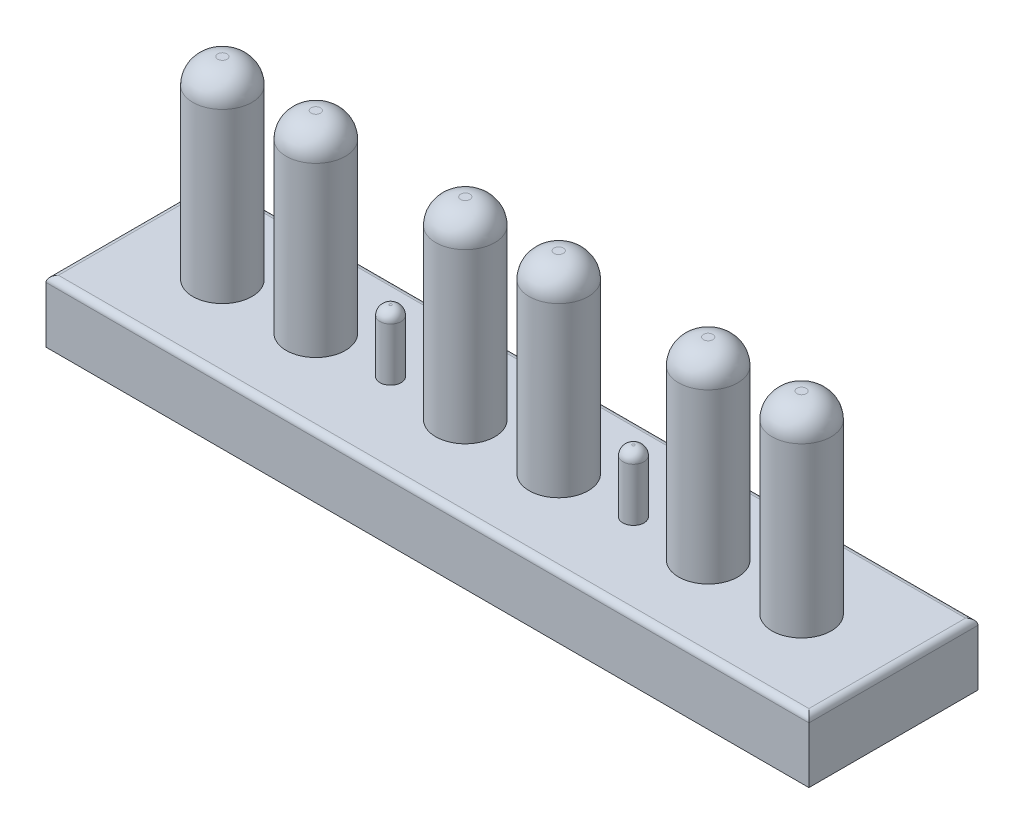
ISO-10303-21;
HEADER;
FILE_DESCRIPTION(('STEP AP214'),'2;1');
FILE_NAME('part.step','',(''),(''),'','','');
FILE_SCHEMA(('AUTOMOTIVE_DESIGN { 1 0 10303 214 1 1 1 1 }'));
ENDSEC;
DATA;
#1=APPLICATION_CONTEXT('core data for automotive mechanical design processes');
#2=APPLICATION_PROTOCOL_DEFINITION('international standard','automotive_design',2000,#1);
#3=PRODUCT_CONTEXT('',#1,'mechanical');
#4=PRODUCT('Part','Part','',(#3));
#5=PRODUCT_RELATED_PRODUCT_CATEGORY('part','',(#4));
#6=PRODUCT_DEFINITION_FORMATION('','',#4);
#7=PRODUCT_DEFINITION_CONTEXT('part definition',#1,'design');
#8=PRODUCT_DEFINITION('design','',#6,#7);
#9=PRODUCT_DEFINITION_SHAPE('','',#8);
#10=(LENGTH_UNIT() NAMED_UNIT(*) SI_UNIT(.MILLI.,.METRE.));
#11=(NAMED_UNIT(*) PLANE_ANGLE_UNIT() SI_UNIT($,.RADIAN.));
#12=(NAMED_UNIT(*) SI_UNIT($,.STERADIAN.) SOLID_ANGLE_UNIT());
#13=UNCERTAINTY_MEASURE_WITH_UNIT(LENGTH_MEASURE(1.E-05),#10,'distance_accuracy_value','');
#14=(GEOMETRIC_REPRESENTATION_CONTEXT(3) GLOBAL_UNCERTAINTY_ASSIGNED_CONTEXT((#13)) GLOBAL_UNIT_ASSIGNED_CONTEXT((#10,
#11,#12)) REPRESENTATION_CONTEXT('',''));
#15=CARTESIAN_POINT('',(0.,0.,0.));
#16=DIRECTION('',(0.,0.,1.));
#17=DIRECTION('',(1.,0.,0.));
#18=AXIS2_PLACEMENT_3D('',#15,#16,#17);
#19=CARTESIAN_POINT('',(62.4574978838138,62.,0.));
#20=DIRECTION('',(0.,-1.,0.));
#21=DIRECTION('',(0.,0.,-1.));
#22=AXIS2_PLACEMENT_3D('',#19,#20,#21);
#23=CYLINDRICAL_SURFACE('',#22,9.49999999999999);
#24=CARTESIAN_POINT('',(62.4574978838138,54.,0.));
#25=DIRECTION('',(0.,1.,0.));
#26=DIRECTION('',(0.,0.,1.));
#27=AXIS2_PLACEMENT_3D('',#24,#25,#26);
#28=CIRCLE('',#27,9.49999999999999);
#29=CARTESIAN_POINT('',(62.4574978838138,54.,9.5));
#30=VERTEX_POINT('',#29);
#31=EDGE_CURVE('E122',#30,#30,#28,.F.);
#32=ORIENTED_EDGE('',*,*,#31,.T.);
#33=EDGE_LOOP('',(#32));
#34=FACE_BOUND('',#33,.T.);
#35=CARTESIAN_POINT('',(62.4574978838138,0.,0.));
#36=DIRECTION('',(0.,1.,0.));
#37=DIRECTION('',(0.,0.,1.));
#38=AXIS2_PLACEMENT_3D('',#35,#36,#37);
#39=CIRCLE('',#38,9.49999999999999);
#40=CARTESIAN_POINT('',(62.4574978838138,0.,9.5));
#41=VERTEX_POINT('',#40);
#42=EDGE_CURVE('E111',#41,#41,#39,.T.);
#43=ORIENTED_EDGE('',*,*,#42,.T.);
#44=EDGE_LOOP('',(#43));
#45=FACE_BOUND('',#44,.T.);
#46=ADVANCED_FACE('F35',(#34,#45),#23,.T.);
#47=CARTESIAN_POINT('',(62.4574978838138,62.,0.));
#48=DIRECTION('',(0.,1.,0.));
#49=DIRECTION('',(0.,0.,1.));
#50=AXIS2_PLACEMENT_3D('',#47,#48,#49);
#51=PLANE('',#50);
#52=CARTESIAN_POINT('',(62.4574978838138,62.,0.));
#53=DIRECTION('',(0.,1.,0.));
#54=DIRECTION('',(0.,0.,1.));
#55=AXIS2_PLACEMENT_3D('',#52,#53,#54);
#56=CIRCLE('',#55,1.49999999999999);
#57=CARTESIAN_POINT('',(62.4574978838138,62.,1.5));
#58=VERTEX_POINT('',#57);
#59=EDGE_CURVE('E114',#58,#58,#56,.T.);
#60=ORIENTED_EDGE('',*,*,#59,.T.);
#61=EDGE_LOOP('',(#60));
#62=FACE_BOUND('',#61,.T.);
#63=ADVANCED_FACE('F238',(#62),#51,.T.);
#64=CARTESIAN_POINT('',(62.4574978838138,54.,0.));
#65=DIRECTION('',(0.,1.,0.));
#66=DIRECTION('',(0.,0.,1.));
#67=AXIS2_PLACEMENT_3D('',#64,#65,#66);
#68=DEGENERATE_TOROIDAL_SURFACE('',#67,1.49999999999999,8.,.T.);
#69=ORIENTED_EDGE('',*,*,#31,.F.);
#70=EDGE_LOOP('',(#69));
#71=FACE_BOUND('',#70,.T.);
#72=ORIENTED_EDGE('',*,*,#59,.F.);
#73=EDGE_LOOP('',(#72));
#74=FACE_BOUND('',#73,.T.);
#75=ADVANCED_FACE('F244',(#71,#74),#68,.T.);
#76=CARTESIAN_POINT('',(-153.042502116186,-20.,-27.146560379265));
#77=DIRECTION('',(1.,0.,0.));
#78=DIRECTION('',(0.,0.,-1.));
#79=AXIS2_PLACEMENT_3D('',#76,#77,#78);
#80=PLANE('',#79);
#81=DIRECTION('',(0.,1.,0.));
#82=VECTOR('',#81,1.);
#83=CARTESIAN_POINT('',(-153.042502116186,-20.,27.1465603792649));
#84=LINE('',#83,#82);
#85=CARTESIAN_POINT('',(-153.042502116186,-20.,27.1465603792649));
#86=VERTEX_POINT('',#85);
#87=CARTESIAN_POINT('',(-153.042502116186,-2.,27.1465603792649));
#88=VERTEX_POINT('',#87);
#89=EDGE_CURVE('E218',#86,#88,#84,.T.);
#90=ORIENTED_EDGE('',*,*,#89,.T.);
#91=DIRECTION('',(0.,0.,-1.));
#92=VECTOR('',#91,1.);
#93=CARTESIAN_POINT('',(-153.042502116186,-2.,-27.146560379265));
#94=LINE('',#93,#92);
#95=CARTESIAN_POINT('',(-153.042502116186,-2.,-27.146560379265));
#96=VERTEX_POINT('',#95);
#97=EDGE_CURVE('E110',#88,#96,#94,.T.);
#98=ORIENTED_EDGE('',*,*,#97,.T.);
#99=DIRECTION('',(0.,1.,0.));
#100=VECTOR('',#99,1.);
#101=CARTESIAN_POINT('',(-153.042502116186,-20.,-27.146560379265));
#102=LINE('',#101,#100);
#103=CARTESIAN_POINT('',(-153.042502116186,-20.,-27.146560379265));
#104=VERTEX_POINT('',#103);
#105=EDGE_CURVE('E91',#104,#96,#102,.T.);
#106=ORIENTED_EDGE('',*,*,#105,.F.);
#107=DIRECTION('',(0.,0.,-1.));
#108=VECTOR('',#107,1.);
#109=CARTESIAN_POINT('',(-153.042502116186,-20.,-27.146560379265));
#110=LINE('',#109,#108);
#111=EDGE_CURVE('E96',#86,#104,#110,.T.);
#112=ORIENTED_EDGE('',*,*,#111,.F.);
#113=EDGE_LOOP('',(#90,#98,#106,#112));
#114=FACE_BOUND('',#113,.T.);
#115=ADVANCED_FACE('F108',(#114),#80,.F.);
#116=CARTESIAN_POINT('',(91.9574978838138,-20.,-27.1465603792649));
#117=DIRECTION('',(0.,0.,1.));
#118=DIRECTION('',(1.,0.,0.));
#119=AXIS2_PLACEMENT_3D('',#116,#117,#118);
#120=PLANE('',#119);
#121=ORIENTED_EDGE('',*,*,#105,.T.);
#122=DIRECTION('',(1.,0.,0.));
#123=VECTOR('',#122,1.);
#124=CARTESIAN_POINT('',(91.9574978838138,-2.,-27.1465603792649));
#125=LINE('',#124,#123);
#126=CARTESIAN_POINT('',(91.9574978838138,-2.,-27.1465603792649));
#127=VERTEX_POINT('',#126);
#128=EDGE_CURVE('E11',#96,#127,#125,.T.);
#129=ORIENTED_EDGE('',*,*,#128,.T.);
#130=DIRECTION('',(0.,1.,0.));
#131=VECTOR('',#130,1.);
#132=CARTESIAN_POINT('',(91.9574978838138,-20.,-27.1465603792649));
#133=LINE('',#132,#131);
#134=CARTESIAN_POINT('',(91.9574978838138,-20.,-27.1465603792649));
#135=VERTEX_POINT('',#134);
#136=EDGE_CURVE('E92',#135,#127,#133,.T.);
#137=ORIENTED_EDGE('',*,*,#136,.F.);
#138=DIRECTION('',(1.,0.,0.));
#139=VECTOR('',#138,1.);
#140=CARTESIAN_POINT('',(91.9574978838138,-20.,-27.1465603792649));
#141=LINE('',#140,#139);
#142=EDGE_CURVE('E87',#104,#135,#141,.T.);
#143=ORIENTED_EDGE('',*,*,#142,.F.);
#144=EDGE_LOOP('',(#121,#129,#137,#143));
#145=FACE_BOUND('',#144,.T.);
#146=ADVANCED_FACE('F89',(#145),#120,.F.);
#147=CARTESIAN_POINT('',(91.9574978838138,-20.,-27.1465603792649));
#148=DIRECTION('',(-1.,0.,0.));
#149=DIRECTION('',(0.,0.,1.));
#150=AXIS2_PLACEMENT_3D('',#147,#148,#149);
#151=PLANE('',#150);
#152=ORIENTED_EDGE('',*,*,#136,.T.);
#153=DIRECTION('',(0.,0.,1.));
#154=VECTOR('',#153,1.);
#155=CARTESIAN_POINT('',(91.9574978838138,-2.,-27.1465603792649));
#156=LINE('',#155,#154);
#157=CARTESIAN_POINT('',(91.9574978838138,-2.,27.1465603792649));
#158=VERTEX_POINT('',#157);
#159=EDGE_CURVE('E44',#127,#158,#156,.T.);
#160=ORIENTED_EDGE('',*,*,#159,.T.);
#161=DIRECTION('',(0.,1.,0.));
#162=VECTOR('',#161,1.);
#163=CARTESIAN_POINT('',(91.9574978838138,-20.,27.1465603792649));
#164=LINE('',#163,#162);
#165=CARTESIAN_POINT('',(91.9574978838138,-20.,27.1465603792649));
#166=VERTEX_POINT('',#165);
#167=EDGE_CURVE('E116',#166,#158,#164,.T.);
#168=ORIENTED_EDGE('',*,*,#167,.F.);
#169=DIRECTION('',(0.,0.,1.));
#170=VECTOR('',#169,1.);
#171=CARTESIAN_POINT('',(91.9574978838138,-20.,-27.1465603792649));
#172=LINE('',#171,#170);
#173=EDGE_CURVE('E95',#135,#166,#172,.T.);
#174=ORIENTED_EDGE('',*,*,#173,.F.);
#175=EDGE_LOOP('',(#152,#160,#168,#174));
#176=FACE_BOUND('',#175,.T.);
#177=ADVANCED_FACE('F261',(#176),#151,.F.);
#178=CARTESIAN_POINT('',(91.9574978838138,-20.,27.1465603792649));
#179=DIRECTION('',(0.,0.,-1.));
#180=DIRECTION('',(-1.,0.,0.));
#181=AXIS2_PLACEMENT_3D('',#178,#179,#180);
#182=PLANE('',#181);
#183=ORIENTED_EDGE('',*,*,#167,.T.);
#184=DIRECTION('',(-1.,0.,0.));
#185=VECTOR('',#184,1.);
#186=CARTESIAN_POINT('',(91.9574978838138,-2.,27.1465603792649));
#187=LINE('',#186,#185);
#188=EDGE_CURVE('E156',#158,#88,#187,.T.);
#189=ORIENTED_EDGE('',*,*,#188,.T.);
#190=ORIENTED_EDGE('',*,*,#89,.F.);
#191=DIRECTION('',(-1.,0.,0.));
#192=VECTOR('',#191,1.);
#193=CARTESIAN_POINT('',(91.9574978838138,-20.,27.1465603792649));
#194=LINE('',#193,#192);
#195=EDGE_CURVE('E101',#166,#86,#194,.T.);
#196=ORIENTED_EDGE('',*,*,#195,.F.);
#197=EDGE_LOOP('',(#183,#189,#190,#196));
#198=FACE_BOUND('',#197,.T.);
#199=ADVANCED_FACE('F220',(#198),#182,.F.);
#200=CARTESIAN_POINT('',(0.,-20.,0.));
#201=DIRECTION('',(0.,-1.,0.));
#202=DIRECTION('',(0.,0.,-1.));
#203=AXIS2_PLACEMENT_3D('',#200,#201,#202);
#204=PLANE('',#203);
#205=ORIENTED_EDGE('',*,*,#111,.T.);
#206=ORIENTED_EDGE('',*,*,#142,.T.);
#207=ORIENTED_EDGE('',*,*,#173,.T.);
#208=ORIENTED_EDGE('',*,*,#195,.T.);
#209=EDGE_LOOP('',(#205,#206,#207,#208));
#210=FACE_BOUND('',#209,.T.);
#211=ADVANCED_FACE('F99',(#210),#204,.T.);
#212=CARTESIAN_POINT('',(0.,0.,0.));
#213=DIRECTION('',(0.,-1.,0.));
#214=DIRECTION('',(0.,0.,-1.));
#215=AXIS2_PLACEMENT_3D('',#212,#213,#214);
#216=PLANE('',#215);
#217=DIRECTION('',(1.,0.,0.));
#218=VECTOR('',#217,1.);
#219=CARTESIAN_POINT('',(0.,0.,-25.146560379265));
#220=LINE('',#219,#218);
#221=CARTESIAN_POINT('',(89.9574978838138,0.,-25.1465603792649));
#222=VERTEX_POINT('',#221);
#223=CARTESIAN_POINT('',(-151.042502116186,0.,-25.146560379265));
#224=VERTEX_POINT('',#223);
#225=EDGE_CURVE('E147',#222,#224,#220,.F.);
#226=ORIENTED_EDGE('',*,*,#225,.T.);
#227=DIRECTION('',(0.,0.,-1.));
#228=VECTOR('',#227,1.);
#229=CARTESIAN_POINT('',(-151.042502116186,0.,0.));
#230=LINE('',#229,#228);
#231=CARTESIAN_POINT('',(-151.042502116186,0.,25.1465603792649));
#232=VERTEX_POINT('',#231);
#233=EDGE_CURVE('E153',#224,#232,#230,.F.);
#234=ORIENTED_EDGE('',*,*,#233,.T.);
#235=DIRECTION('',(-1.,0.,0.));
#236=VECTOR('',#235,1.);
#237=CARTESIAN_POINT('',(0.,0.,25.1465603792649));
#238=LINE('',#237,#236);
#239=CARTESIAN_POINT('',(89.9574978838138,0.,25.1465603792649));
#240=VERTEX_POINT('',#239);
#241=EDGE_CURVE('E151',#232,#240,#238,.F.);
#242=ORIENTED_EDGE('',*,*,#241,.T.);
#243=DIRECTION('',(0.,0.,1.));
#244=VECTOR('',#243,1.);
#245=CARTESIAN_POINT('',(89.9574978838138,0.,0.));
#246=LINE('',#245,#244);
#247=EDGE_CURVE('E149',#240,#222,#246,.F.);
#248=ORIENTED_EDGE('',*,*,#247,.T.);
#249=EDGE_LOOP('',(#226,#234,#242,#248));
#250=FACE_BOUND('',#249,.T.);
#251=CARTESIAN_POINT('',(-69.5425021161862,0.,0.));
#252=DIRECTION('',(0.,-1.,0.));
#253=DIRECTION('',(0.,0.,-1.));
#254=AXIS2_PLACEMENT_3D('',#251,#252,#253);
#255=CIRCLE('',#254,3.4);
#256=CARTESIAN_POINT('',(-69.5425021161862,0.,-3.39999999999997));
#257=VERTEX_POINT('',#256);
#258=EDGE_CURVE('E143',#257,#257,#255,.F.);
#259=ORIENTED_EDGE('',*,*,#258,.F.);
#260=EDGE_LOOP('',(#259));
#261=FACE_BOUND('',#260,.T.);
#262=CARTESIAN_POINT('',(8.45749788381382,0.,0.));
#263=DIRECTION('',(0.,-1.,0.));
#264=DIRECTION('',(0.,0.,-1.));
#265=AXIS2_PLACEMENT_3D('',#262,#263,#264);
#266=CIRCLE('',#265,3.4);
#267=CARTESIAN_POINT('',(8.45749788381382,0.,-3.39999999999998));
#268=VERTEX_POINT('',#267);
#269=EDGE_CURVE('E140',#268,#268,#266,.F.);
#270=ORIENTED_EDGE('',*,*,#269,.F.);
#271=EDGE_LOOP('',(#270));
#272=FACE_BOUND('',#271,.T.);
#273=CARTESIAN_POINT('',(-93.5425021161862,0.,0.));
#274=DIRECTION('',(0.,-1.,0.));
#275=DIRECTION('',(0.,0.,-1.));
#276=AXIS2_PLACEMENT_3D('',#273,#274,#275);
#277=CIRCLE('',#276,9.49999999999999);
#278=CARTESIAN_POINT('',(-93.5425021161862,0.,-9.49999999999996));
#279=VERTEX_POINT('',#278);
#280=EDGE_CURVE('E137',#279,#279,#277,.F.);
#281=ORIENTED_EDGE('',*,*,#280,.F.);
#282=EDGE_LOOP('',(#281));
#283=FACE_BOUND('',#282,.T.);
#284=CARTESIAN_POINT('',(-45.5425021161862,0.,0.));
#285=DIRECTION('',(0.,-1.,0.));
#286=DIRECTION('',(0.,0.,-1.));
#287=AXIS2_PLACEMENT_3D('',#284,#285,#286);
#288=CIRCLE('',#287,9.5);
#289=CARTESIAN_POINT('',(-45.5425021161862,0.,-9.49999999999998));
#290=VERTEX_POINT('',#289);
#291=EDGE_CURVE('E134',#290,#290,#288,.F.);
#292=ORIENTED_EDGE('',*,*,#291,.F.);
#293=EDGE_LOOP('',(#292));
#294=FACE_BOUND('',#293,.T.);
#295=CARTESIAN_POINT('',(-15.5425021161862,0.,0.));
#296=DIRECTION('',(0.,-1.,0.));
#297=DIRECTION('',(0.,0.,-1.));
#298=AXIS2_PLACEMENT_3D('',#295,#296,#297);
#299=CIRCLE('',#298,9.5);
#300=CARTESIAN_POINT('',(-15.5425021161862,0.,-9.49999999999998));
#301=VERTEX_POINT('',#300);
#302=EDGE_CURVE('E131',#301,#301,#299,.F.);
#303=ORIENTED_EDGE('',*,*,#302,.F.);
#304=EDGE_LOOP('',(#303));
#305=FACE_BOUND('',#304,.T.);
#306=CARTESIAN_POINT('',(-123.542502116186,0.,0.));
#307=DIRECTION('',(0.,-1.,0.));
#308=DIRECTION('',(0.,0.,-1.));
#309=AXIS2_PLACEMENT_3D('',#306,#307,#308);
#310=CIRCLE('',#309,9.49999999999999);
#311=CARTESIAN_POINT('',(-123.542502116186,0.,-9.49999999999996));
#312=VERTEX_POINT('',#311);
#313=EDGE_CURVE('E128',#312,#312,#310,.F.);
#314=ORIENTED_EDGE('',*,*,#313,.F.);
#315=EDGE_LOOP('',(#314));
#316=FACE_BOUND('',#315,.T.);
#317=CARTESIAN_POINT('',(32.4574978838138,0.,0.));
#318=DIRECTION('',(0.,-1.,0.));
#319=DIRECTION('',(0.,0.,-1.));
#320=AXIS2_PLACEMENT_3D('',#317,#318,#319);
#321=CIRCLE('',#320,9.50000000000001);
#322=CARTESIAN_POINT('',(32.4574978838138,0.,-9.49999999999999));
#323=VERTEX_POINT('',#322);
#324=EDGE_CURVE('E125',#323,#323,#321,.F.);
#325=ORIENTED_EDGE('',*,*,#324,.F.);
#326=EDGE_LOOP('',(#325));
#327=FACE_BOUND('',#326,.T.);
#328=ORIENTED_EDGE('',*,*,#42,.F.);
#329=EDGE_LOOP('',(#328));
#330=FACE_BOUND('',#329,.T.);
#331=ADVANCED_FACE('F268',(#250,#261,#272,#283,#294,#305,#316,#327,#330),#216,.F.);
#332=CARTESIAN_POINT('',(32.4574978838138,62.,0.));
#333=DIRECTION('',(0.,-1.,0.));
#334=DIRECTION('',(0.,0.,-1.));
#335=AXIS2_PLACEMENT_3D('',#332,#333,#334);
#336=CYLINDRICAL_SURFACE('',#335,9.50000000000001);
#337=CARTESIAN_POINT('',(32.4574978838138,54.,0.));
#338=DIRECTION('',(0.,1.,0.));
#339=DIRECTION('',(0.,0.,1.));
#340=AXIS2_PLACEMENT_3D('',#337,#338,#339);
#341=CIRCLE('',#340,9.50000000000001);
#342=CARTESIAN_POINT('',(32.4574978838138,54.,9.50000000000002));
#343=VERTEX_POINT('',#342);
#344=EDGE_CURVE('E105',#343,#343,#341,.F.);
#345=ORIENTED_EDGE('',*,*,#344,.T.);
#346=EDGE_LOOP('',(#345));
#347=FACE_BOUND('',#346,.T.);
#348=ORIENTED_EDGE('',*,*,#324,.T.);
#349=EDGE_LOOP('',(#348));
#350=FACE_BOUND('',#349,.T.);
#351=ADVANCED_FACE('F271',(#347,#350),#336,.T.);
#352=CARTESIAN_POINT('',(32.4574978838138,62.,0.));
#353=DIRECTION('',(0.,1.,0.));
#354=DIRECTION('',(0.,0.,1.));
#355=AXIS2_PLACEMENT_3D('',#352,#353,#354);
#356=PLANE('',#355);
#357=CARTESIAN_POINT('',(32.4574978838138,62.,0.));
#358=DIRECTION('',(0.,1.,0.));
#359=DIRECTION('',(0.,0.,1.));
#360=AXIS2_PLACEMENT_3D('',#357,#358,#359);
#361=CIRCLE('',#360,1.50000000000001);
#362=CARTESIAN_POINT('',(32.4574978838138,62.,1.50000000000002));
#363=VERTEX_POINT('',#362);
#364=EDGE_CURVE('E211',#363,#363,#361,.T.);
#365=ORIENTED_EDGE('',*,*,#364,.T.);
#366=EDGE_LOOP('',(#365));
#367=FACE_BOUND('',#366,.T.);
#368=ADVANCED_FACE('F279',(#367),#356,.T.);
#369=CARTESIAN_POINT('',(32.4574978838138,54.,0.));
#370=DIRECTION('',(0.,1.,0.));
#371=DIRECTION('',(0.,0.,1.));
#372=AXIS2_PLACEMENT_3D('',#369,#370,#371);
#373=DEGENERATE_TOROIDAL_SURFACE('',#372,1.50000000000001,8.,.T.);
#374=ORIENTED_EDGE('',*,*,#344,.F.);
#375=EDGE_LOOP('',(#374));
#376=FACE_BOUND('',#375,.T.);
#377=ORIENTED_EDGE('',*,*,#364,.F.);
#378=EDGE_LOOP('',(#377));
#379=FACE_BOUND('',#378,.T.);
#380=ADVANCED_FACE('F275',(#376,#379),#373,.T.);
#381=CARTESIAN_POINT('',(-123.542502116186,62.,0.));
#382=DIRECTION('',(0.,-1.,0.));
#383=DIRECTION('',(0.,0.,-1.));
#384=AXIS2_PLACEMENT_3D('',#381,#382,#383);
#385=CYLINDRICAL_SURFACE('',#384,9.49999999999999);
#386=CARTESIAN_POINT('',(-123.542502116186,54.,0.));
#387=DIRECTION('',(0.,1.,0.));
#388=DIRECTION('',(0.,0.,1.));
#389=AXIS2_PLACEMENT_3D('',#386,#387,#388);
#390=CIRCLE('',#389,9.49999999999999);
#391=CARTESIAN_POINT('',(-123.542502116186,54.,9.50000000000003));
#392=VERTEX_POINT('',#391);
#393=EDGE_CURVE('E208',#392,#392,#390,.F.);
#394=ORIENTED_EDGE('',*,*,#393,.T.);
#395=EDGE_LOOP('',(#394));
#396=FACE_BOUND('',#395,.T.);
#397=ORIENTED_EDGE('',*,*,#313,.T.);
#398=EDGE_LOOP('',(#397));
#399=FACE_BOUND('',#398,.T.);
#400=ADVANCED_FACE('F278',(#396,#399),#385,.T.);
#401=CARTESIAN_POINT('',(-123.542502116186,62.,0.));
#402=DIRECTION('',(0.,1.,0.));
#403=DIRECTION('',(0.,0.,1.));
#404=AXIS2_PLACEMENT_3D('',#401,#402,#403);
#405=PLANE('',#404);
#406=CARTESIAN_POINT('',(-123.542502116186,62.,0.));
#407=DIRECTION('',(0.,1.,0.));
#408=DIRECTION('',(0.,0.,1.));
#409=AXIS2_PLACEMENT_3D('',#406,#407,#408);
#410=CIRCLE('',#409,1.49999999999999);
#411=CARTESIAN_POINT('',(-123.542502116186,62.,1.50000000000003));
#412=VERTEX_POINT('',#411);
#413=EDGE_CURVE('E205',#412,#412,#410,.T.);
#414=ORIENTED_EDGE('',*,*,#413,.T.);
#415=EDGE_LOOP('',(#414));
#416=FACE_BOUND('',#415,.T.);
#417=ADVANCED_FACE('F291',(#416),#405,.T.);
#418=CARTESIAN_POINT('',(-123.542502116186,54.,0.));
#419=DIRECTION('',(0.,1.,0.));
#420=DIRECTION('',(0.,0.,1.));
#421=AXIS2_PLACEMENT_3D('',#418,#419,#420);
#422=DEGENERATE_TOROIDAL_SURFACE('',#421,1.49999999999999,8.,.T.);
#423=ORIENTED_EDGE('',*,*,#393,.F.);
#424=EDGE_LOOP('',(#423));
#425=FACE_BOUND('',#424,.T.);
#426=ORIENTED_EDGE('',*,*,#413,.F.);
#427=EDGE_LOOP('',(#426));
#428=FACE_BOUND('',#427,.T.);
#429=ADVANCED_FACE('F287',(#425,#428),#422,.T.);
#430=CARTESIAN_POINT('',(-15.5425021161862,62.,0.));
#431=DIRECTION('',(0.,-1.,0.));
#432=DIRECTION('',(0.,0.,-1.));
#433=AXIS2_PLACEMENT_3D('',#430,#431,#432);
#434=CYLINDRICAL_SURFACE('',#433,9.5);
#435=CARTESIAN_POINT('',(-15.5425021161862,54.,0.));
#436=DIRECTION('',(0.,1.,0.));
#437=DIRECTION('',(0.,0.,1.));
#438=AXIS2_PLACEMENT_3D('',#435,#436,#437);
#439=CIRCLE('',#438,9.5);
#440=CARTESIAN_POINT('',(-15.5425021161862,54.,9.50000000000002));
#441=VERTEX_POINT('',#440);
#442=EDGE_CURVE('E202',#441,#441,#439,.F.);
#443=ORIENTED_EDGE('',*,*,#442,.T.);
#444=EDGE_LOOP('',(#443));
#445=FACE_BOUND('',#444,.T.);
#446=ORIENTED_EDGE('',*,*,#302,.T.);
#447=EDGE_LOOP('',(#446));
#448=FACE_BOUND('',#447,.T.);
#449=ADVANCED_FACE('F290',(#445,#448),#434,.T.);
#450=CARTESIAN_POINT('',(-15.5425021161862,62.,0.));
#451=DIRECTION('',(0.,1.,0.));
#452=DIRECTION('',(0.,0.,1.));
#453=AXIS2_PLACEMENT_3D('',#450,#451,#452);
#454=PLANE('',#453);
#455=CARTESIAN_POINT('',(-15.5425021161862,62.,0.));
#456=DIRECTION('',(0.,1.,0.));
#457=DIRECTION('',(0.,0.,1.));
#458=AXIS2_PLACEMENT_3D('',#455,#456,#457);
#459=CIRCLE('',#458,1.5);
#460=CARTESIAN_POINT('',(-15.5425021161862,62.,1.50000000000002));
#461=VERTEX_POINT('',#460);
#462=EDGE_CURVE('E199',#461,#461,#459,.T.);
#463=ORIENTED_EDGE('',*,*,#462,.T.);
#464=EDGE_LOOP('',(#463));
#465=FACE_BOUND('',#464,.T.);
#466=ADVANCED_FACE('F303',(#465),#454,.T.);
#467=CARTESIAN_POINT('',(-15.5425021161862,54.,0.));
#468=DIRECTION('',(0.,1.,0.));
#469=DIRECTION('',(0.,0.,1.));
#470=AXIS2_PLACEMENT_3D('',#467,#468,#469);
#471=DEGENERATE_TOROIDAL_SURFACE('',#470,1.5,8.,.T.);
#472=ORIENTED_EDGE('',*,*,#442,.F.);
#473=EDGE_LOOP('',(#472));
#474=FACE_BOUND('',#473,.T.);
#475=ORIENTED_EDGE('',*,*,#462,.F.);
#476=EDGE_LOOP('',(#475));
#477=FACE_BOUND('',#476,.T.);
#478=ADVANCED_FACE('F299',(#474,#477),#471,.T.);
#479=CARTESIAN_POINT('',(-45.5425021161862,62.,0.));
#480=DIRECTION('',(0.,-1.,0.));
#481=DIRECTION('',(0.,0.,-1.));
#482=AXIS2_PLACEMENT_3D('',#479,#480,#481);
#483=CYLINDRICAL_SURFACE('',#482,9.5);
#484=CARTESIAN_POINT('',(-45.5425021161862,54.,0.));
#485=DIRECTION('',(0.,1.,0.));
#486=DIRECTION('',(0.,0.,1.));
#487=AXIS2_PLACEMENT_3D('',#484,#485,#486);
#488=CIRCLE('',#487,9.5);
#489=CARTESIAN_POINT('',(-45.5425021161862,54.,9.50000000000003));
#490=VERTEX_POINT('',#489);
#491=EDGE_CURVE('E196',#490,#490,#488,.F.);
#492=ORIENTED_EDGE('',*,*,#491,.T.);
#493=EDGE_LOOP('',(#492));
#494=FACE_BOUND('',#493,.T.);
#495=ORIENTED_EDGE('',*,*,#291,.T.);
#496=EDGE_LOOP('',(#495));
#497=FACE_BOUND('',#496,.T.);
#498=ADVANCED_FACE('F302',(#494,#497),#483,.T.);
#499=CARTESIAN_POINT('',(-45.5425021161862,62.,0.));
#500=DIRECTION('',(0.,1.,0.));
#501=DIRECTION('',(0.,0.,1.));
#502=AXIS2_PLACEMENT_3D('',#499,#500,#501);
#503=PLANE('',#502);
#504=CARTESIAN_POINT('',(-45.5425021161862,62.,0.));
#505=DIRECTION('',(0.,1.,0.));
#506=DIRECTION('',(0.,0.,1.));
#507=AXIS2_PLACEMENT_3D('',#504,#505,#506);
#508=CIRCLE('',#507,1.5);
#509=CARTESIAN_POINT('',(-45.5425021161862,62.,1.50000000000003));
#510=VERTEX_POINT('',#509);
#511=EDGE_CURVE('E193',#510,#510,#508,.T.);
#512=ORIENTED_EDGE('',*,*,#511,.T.);
#513=EDGE_LOOP('',(#512));
#514=FACE_BOUND('',#513,.T.);
#515=ADVANCED_FACE('F315',(#514),#503,.T.);
#516=CARTESIAN_POINT('',(-45.5425021161862,54.,0.));
#517=DIRECTION('',(0.,1.,0.));
#518=DIRECTION('',(0.,0.,1.));
#519=AXIS2_PLACEMENT_3D('',#516,#517,#518);
#520=DEGENERATE_TOROIDAL_SURFACE('',#519,1.5,8.,.T.);
#521=ORIENTED_EDGE('',*,*,#491,.F.);
#522=EDGE_LOOP('',(#521));
#523=FACE_BOUND('',#522,.T.);
#524=ORIENTED_EDGE('',*,*,#511,.F.);
#525=EDGE_LOOP('',(#524));
#526=FACE_BOUND('',#525,.T.);
#527=ADVANCED_FACE('F311',(#523,#526),#520,.T.);
#528=CARTESIAN_POINT('',(-93.5425021161862,62.,0.));
#529=DIRECTION('',(0.,-1.,0.));
#530=DIRECTION('',(0.,0.,-1.));
#531=AXIS2_PLACEMENT_3D('',#528,#529,#530);
#532=CYLINDRICAL_SURFACE('',#531,9.49999999999999);
#533=CARTESIAN_POINT('',(-93.5425021161862,54.,0.));
#534=DIRECTION('',(0.,1.,0.));
#535=DIRECTION('',(0.,0.,1.));
#536=AXIS2_PLACEMENT_3D('',#533,#534,#535);
#537=CIRCLE('',#536,9.49999999999999);
#538=CARTESIAN_POINT('',(-93.5425021161862,54.,9.50000000000003));
#539=VERTEX_POINT('',#538);
#540=EDGE_CURVE('E190',#539,#539,#537,.F.);
#541=ORIENTED_EDGE('',*,*,#540,.T.);
#542=EDGE_LOOP('',(#541));
#543=FACE_BOUND('',#542,.T.);
#544=ORIENTED_EDGE('',*,*,#280,.T.);
#545=EDGE_LOOP('',(#544));
#546=FACE_BOUND('',#545,.T.);
#547=ADVANCED_FACE('F314',(#543,#546),#532,.T.);
#548=CARTESIAN_POINT('',(-93.5425021161862,62.,0.));
#549=DIRECTION('',(0.,1.,0.));
#550=DIRECTION('',(0.,0.,1.));
#551=AXIS2_PLACEMENT_3D('',#548,#549,#550);
#552=PLANE('',#551);
#553=CARTESIAN_POINT('',(-93.5425021161862,62.,0.));
#554=DIRECTION('',(0.,1.,0.));
#555=DIRECTION('',(0.,0.,1.));
#556=AXIS2_PLACEMENT_3D('',#553,#554,#555);
#557=CIRCLE('',#556,1.49999999999999);
#558=CARTESIAN_POINT('',(-93.5425021161862,62.,1.50000000000003));
#559=VERTEX_POINT('',#558);
#560=EDGE_CURVE('E187',#559,#559,#557,.T.);
#561=ORIENTED_EDGE('',*,*,#560,.T.);
#562=EDGE_LOOP('',(#561));
#563=FACE_BOUND('',#562,.T.);
#564=ADVANCED_FACE('F327',(#563),#552,.T.);
#565=CARTESIAN_POINT('',(-93.5425021161862,54.,0.));
#566=DIRECTION('',(0.,1.,0.));
#567=DIRECTION('',(0.,0.,1.));
#568=AXIS2_PLACEMENT_3D('',#565,#566,#567);
#569=DEGENERATE_TOROIDAL_SURFACE('',#568,1.49999999999999,8.,.T.);
#570=ORIENTED_EDGE('',*,*,#540,.F.);
#571=EDGE_LOOP('',(#570));
#572=FACE_BOUND('',#571,.T.);
#573=ORIENTED_EDGE('',*,*,#560,.F.);
#574=EDGE_LOOP('',(#573));
#575=FACE_BOUND('',#574,.T.);
#576=ADVANCED_FACE('F323',(#572,#575),#569,.T.);
#577=CARTESIAN_POINT('',(8.45749788381382,20.,0.));
#578=DIRECTION('',(0.,-1.,0.));
#579=DIRECTION('',(0.,0.,-1.));
#580=AXIS2_PLACEMENT_3D('',#577,#578,#579);
#581=CYLINDRICAL_SURFACE('',#580,3.4);
#582=CARTESIAN_POINT('',(8.45749788381382,17.,0.));
#583=DIRECTION('',(0.,1.,0.));
#584=DIRECTION('',(0.,0.,1.));
#585=AXIS2_PLACEMENT_3D('',#582,#583,#584);
#586=CIRCLE('',#585,3.4);
#587=CARTESIAN_POINT('',(8.45749788381382,17.,3.40000000000002));
#588=VERTEX_POINT('',#587);
#589=EDGE_CURVE('E184',#588,#588,#586,.F.);
#590=ORIENTED_EDGE('',*,*,#589,.T.);
#591=EDGE_LOOP('',(#590));
#592=FACE_BOUND('',#591,.T.);
#593=ORIENTED_EDGE('',*,*,#269,.T.);
#594=EDGE_LOOP('',(#593));
#595=FACE_BOUND('',#594,.T.);
#596=ADVANCED_FACE('F326',(#592,#595),#581,.T.);
#597=CARTESIAN_POINT('',(8.45749788381382,20.,0.));
#598=DIRECTION('',(0.,1.,0.));
#599=DIRECTION('',(0.,0.,1.));
#600=AXIS2_PLACEMENT_3D('',#597,#598,#599);
#601=PLANE('',#600);
#602=CARTESIAN_POINT('',(8.45749788381382,20.,0.));
#603=DIRECTION('',(0.,1.,0.));
#604=DIRECTION('',(0.,0.,1.));
#605=AXIS2_PLACEMENT_3D('',#602,#603,#604);
#606=CIRCLE('',#605,0.400000000000001);
#607=CARTESIAN_POINT('',(8.45749788381382,20.,0.40000000000002));
#608=VERTEX_POINT('',#607);
#609=EDGE_CURVE('E179',#608,#608,#606,.T.);
#610=ORIENTED_EDGE('',*,*,#609,.T.);
#611=EDGE_LOOP('',(#610));
#612=FACE_BOUND('',#611,.T.);
#613=ADVANCED_FACE('F339',(#612),#601,.T.);
#614=CARTESIAN_POINT('',(8.45749788381382,17.,0.));
#615=DIRECTION('',(0.,1.,0.));
#616=DIRECTION('',(0.,0.,1.));
#617=AXIS2_PLACEMENT_3D('',#614,#615,#616);
#618=DEGENERATE_TOROIDAL_SURFACE('',#617,0.400000000000001,3.,.T.);
#619=ORIENTED_EDGE('',*,*,#589,.F.);
#620=EDGE_LOOP('',(#619));
#621=FACE_BOUND('',#620,.T.);
#622=ORIENTED_EDGE('',*,*,#609,.F.);
#623=EDGE_LOOP('',(#622));
#624=FACE_BOUND('',#623,.T.);
#625=ADVANCED_FACE('F335',(#621,#624),#618,.T.);
#626=CARTESIAN_POINT('',(-69.5425021161862,20.,0.));
#627=DIRECTION('',(0.,-1.,0.));
#628=DIRECTION('',(0.,0.,-1.));
#629=AXIS2_PLACEMENT_3D('',#626,#627,#628);
#630=CYLINDRICAL_SURFACE('',#629,3.4);
#631=CARTESIAN_POINT('',(-69.5425021161862,17.,0.));
#632=DIRECTION('',(0.,1.,0.));
#633=DIRECTION('',(0.,0.,1.));
#634=AXIS2_PLACEMENT_3D('',#631,#632,#633);
#635=CIRCLE('',#634,3.4);
#636=CARTESIAN_POINT('',(-69.5425021161862,17.,3.40000000000003));
#637=VERTEX_POINT('',#636);
#638=EDGE_CURVE('E174',#637,#637,#635,.F.);
#639=ORIENTED_EDGE('',*,*,#638,.T.);
#640=EDGE_LOOP('',(#639));
#641=FACE_BOUND('',#640,.T.);
#642=ORIENTED_EDGE('',*,*,#258,.T.);
#643=EDGE_LOOP('',(#642));
#644=FACE_BOUND('',#643,.T.);
#645=ADVANCED_FACE('F338',(#641,#644),#630,.T.);
#646=CARTESIAN_POINT('',(-69.5425021161862,20.,0.));
#647=DIRECTION('',(0.,1.,0.));
#648=DIRECTION('',(0.,0.,1.));
#649=AXIS2_PLACEMENT_3D('',#646,#647,#648);
#650=PLANE('',#649);
#651=CARTESIAN_POINT('',(-69.5425021161862,20.,0.));
#652=DIRECTION('',(0.,1.,0.));
#653=DIRECTION('',(0.,0.,1.));
#654=AXIS2_PLACEMENT_3D('',#651,#652,#653);
#655=CIRCLE('',#654,0.399999999999999);
#656=CARTESIAN_POINT('',(-69.5425021161862,20.,0.400000000000028));
#657=VERTEX_POINT('',#656);
#658=EDGE_CURVE('E168',#657,#657,#655,.T.);
#659=ORIENTED_EDGE('',*,*,#658,.T.);
#660=EDGE_LOOP('',(#659));
#661=FACE_BOUND('',#660,.T.);
#662=ADVANCED_FACE('F350',(#661),#650,.T.);
#663=CARTESIAN_POINT('',(-69.5425021161862,17.,0.));
#664=DIRECTION('',(0.,1.,0.));
#665=DIRECTION('',(0.,0.,1.));
#666=AXIS2_PLACEMENT_3D('',#663,#664,#665);
#667=DEGENERATE_TOROIDAL_SURFACE('',#666,0.399999999999999,3.,.T.);
#668=ORIENTED_EDGE('',*,*,#638,.F.);
#669=EDGE_LOOP('',(#668));
#670=FACE_BOUND('',#669,.T.);
#671=ORIENTED_EDGE('',*,*,#658,.F.);
#672=EDGE_LOOP('',(#671));
#673=FACE_BOUND('',#672,.T.);
#674=ADVANCED_FACE('F347',(#670,#673),#667,.T.);
#675=CARTESIAN_POINT('',(89.9574978838138,-2.,-27.1465603792649));
#676=DIRECTION('',(0.,0.,1.));
#677=DIRECTION('',(1.,0.,0.));
#678=AXIS2_PLACEMENT_3D('',#675,#676,#677);
#679=CYLINDRICAL_SURFACE('',#678,2.);
#680=CARTESIAN_POINT('',(89.9574978838138,-2.,-25.1465603792649));
#681=DIRECTION('',(0.707106781186547,0.,0.707106781186547));
#682=DIRECTION('',(0.707106781186548,0.,-0.707106781186547));
#683=AXIS2_PLACEMENT_3D('',#680,#681,#682);
#684=ELLIPSE('',#683,2.82842712474619,2.);
#685=EDGE_CURVE('E162',#222,#127,#684,.F.);
#686=ORIENTED_EDGE('',*,*,#685,.F.);
#687=ORIENTED_EDGE('',*,*,#247,.F.);
#688=CARTESIAN_POINT('',(89.9574978838138,-2.,25.1465603792649));
#689=DIRECTION('',(-0.707106781186547,0.,0.707106781186547));
#690=DIRECTION('',(0.707106781186547,0.,0.707106781186547));
#691=AXIS2_PLACEMENT_3D('',#688,#689,#690);
#692=ELLIPSE('',#691,2.82842712474619,2.);
#693=EDGE_CURVE('E39',#158,#240,#692,.T.);
#694=ORIENTED_EDGE('',*,*,#693,.F.);
#695=ORIENTED_EDGE('',*,*,#159,.F.);
#696=EDGE_LOOP('',(#686,#687,#694,#695));
#697=FACE_BOUND('',#696,.T.);
#698=ADVANCED_FACE('F37',(#697),#679,.T.);
#699=CARTESIAN_POINT('',(91.9574978838138,-2.,25.1465603792649));
#700=DIRECTION('',(-1.,0.,0.));
#701=DIRECTION('',(0.,0.,1.));
#702=AXIS2_PLACEMENT_3D('',#699,#700,#701);
#703=CYLINDRICAL_SURFACE('',#702,2.);
#704=ORIENTED_EDGE('',*,*,#693,.T.);
#705=ORIENTED_EDGE('',*,*,#241,.F.);
#706=CARTESIAN_POINT('',(-151.042502116186,-2.,25.1465603792649));
#707=DIRECTION('',(-0.707106781186547,0.,-0.707106781186547));
#708=DIRECTION('',(-0.707106781186547,0.,0.707106781186547));
#709=AXIS2_PLACEMENT_3D('',#706,#707,#708);
#710=ELLIPSE('',#709,2.82842712474619,2.);
#711=EDGE_CURVE('E161',#88,#232,#710,.T.);
#712=ORIENTED_EDGE('',*,*,#711,.F.);
#713=ORIENTED_EDGE('',*,*,#188,.F.);
#714=EDGE_LOOP('',(#704,#705,#712,#713));
#715=FACE_BOUND('',#714,.T.);
#716=ADVANCED_FACE('F224',(#715),#703,.T.);
#717=CARTESIAN_POINT('',(91.9574978838138,-2.,-25.1465603792649));
#718=DIRECTION('',(1.,0.,0.));
#719=DIRECTION('',(0.,0.,-1.));
#720=AXIS2_PLACEMENT_3D('',#717,#718,#719);
#721=CYLINDRICAL_SURFACE('',#720,2.);
#722=ORIENTED_EDGE('',*,*,#685,.T.);
#723=ORIENTED_EDGE('',*,*,#128,.F.);
#724=CARTESIAN_POINT('',(-151.042502116186,-2.,-25.146560379265));
#725=DIRECTION('',(0.707106781186548,0.,-0.707106781186547));
#726=DIRECTION('',(0.707106781186547,0.,0.707106781186547));
#727=AXIS2_PLACEMENT_3D('',#724,#725,#726);
#728=ELLIPSE('',#727,2.82842712474619,2.);
#729=EDGE_CURVE('E159',#224,#96,#728,.F.);
#730=ORIENTED_EDGE('',*,*,#729,.F.);
#731=ORIENTED_EDGE('',*,*,#225,.F.);
#732=EDGE_LOOP('',(#722,#723,#730,#731));
#733=FACE_BOUND('',#732,.T.);
#734=ADVANCED_FACE('F229',(#733),#721,.T.);
#735=CARTESIAN_POINT('',(-151.042502116186,-2.,-27.146560379265));
#736=DIRECTION('',(0.,0.,-1.));
#737=DIRECTION('',(-1.,0.,0.));
#738=AXIS2_PLACEMENT_3D('',#735,#736,#737);
#739=CYLINDRICAL_SURFACE('',#738,2.);
#740=ORIENTED_EDGE('',*,*,#711,.T.);
#741=ORIENTED_EDGE('',*,*,#233,.F.);
#742=ORIENTED_EDGE('',*,*,#729,.T.);
#743=ORIENTED_EDGE('',*,*,#97,.F.);
#744=EDGE_LOOP('',(#740,#741,#742,#743));
#745=FACE_BOUND('',#744,.T.);
#746=ADVANCED_FACE('F227',(#745),#739,.T.);
#747=CLOSED_SHELL('',(#46,#63,#75,#115,#146,#177,#199,#211,#331,#351,#368,#380,#400,#417,#429,
#449,#466,#478,#498,#515,#527,#547,#564,#576,#596,#613,#625,#645,#662,#674,#698,#716,#734,#746));
#748=MANIFOLD_SOLID_BREP('B2',#747);
#749=ADVANCED_BREP_SHAPE_REPRESENTATION('',(#18,#748),#14);
#750=SHAPE_DEFINITION_REPRESENTATION(#9,#749);
ENDSEC;
END-ISO-10303-21;
